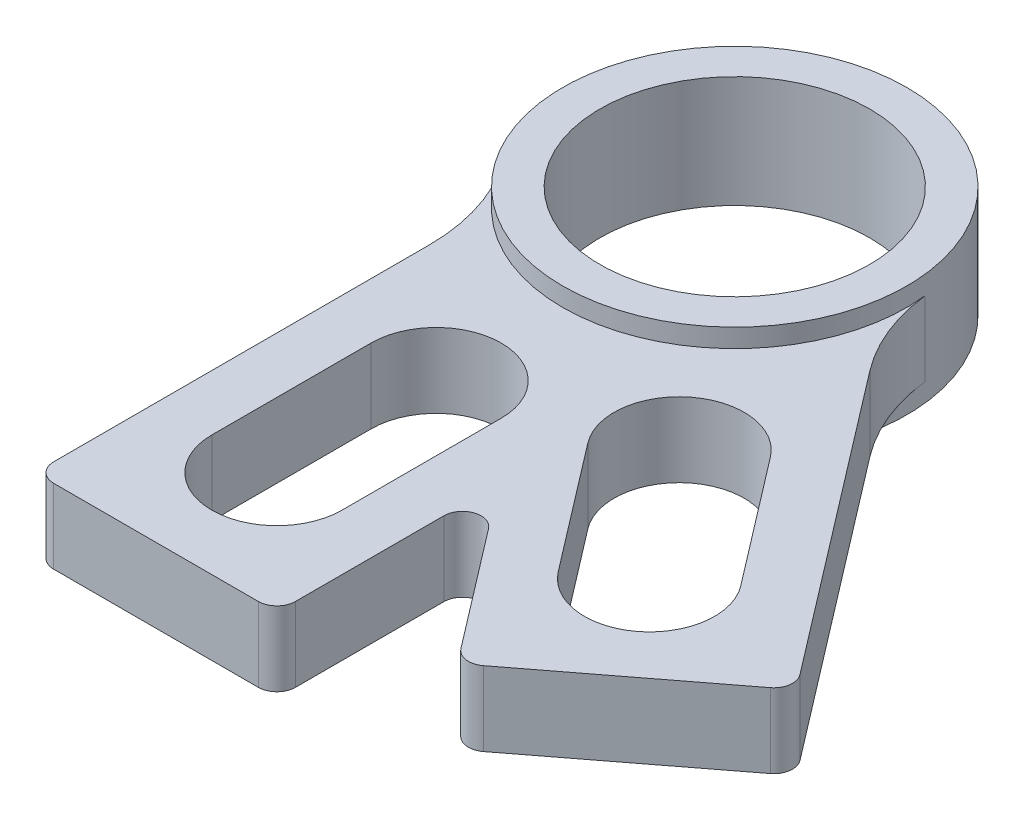
ISO-10303-21;
HEADER;
FILE_DESCRIPTION(('STEP AP214'),'2;1');
FILE_NAME('part.step','',(''),(''),'','','');
FILE_SCHEMA(('AUTOMOTIVE_DESIGN { 1 0 10303 214 1 1 1 1 }'));
ENDSEC;
DATA;
#1=APPLICATION_CONTEXT('core data for automotive mechanical design processes');
#2=APPLICATION_PROTOCOL_DEFINITION('international standard','automotive_design',2000,#1);
#3=PRODUCT_CONTEXT('',#1,'mechanical');
#4=PRODUCT('Part','Part','',(#3));
#5=PRODUCT_RELATED_PRODUCT_CATEGORY('part','',(#4));
#6=PRODUCT_DEFINITION_FORMATION('','',#4);
#7=PRODUCT_DEFINITION_CONTEXT('part definition',#1,'design');
#8=PRODUCT_DEFINITION('design','',#6,#7);
#9=PRODUCT_DEFINITION_SHAPE('','',#8);
#10=(LENGTH_UNIT() NAMED_UNIT(*) SI_UNIT(.MILLI.,.METRE.));
#11=(NAMED_UNIT(*) PLANE_ANGLE_UNIT() SI_UNIT($,.RADIAN.));
#12=(NAMED_UNIT(*) SI_UNIT($,.STERADIAN.) SOLID_ANGLE_UNIT());
#13=UNCERTAINTY_MEASURE_WITH_UNIT(LENGTH_MEASURE(1.E-05),#10,'distance_accuracy_value','');
#14=(GEOMETRIC_REPRESENTATION_CONTEXT(3) GLOBAL_UNCERTAINTY_ASSIGNED_CONTEXT((#13)) GLOBAL_UNIT_ASSIGNED_CONTEXT((#10,
#11,#12)) REPRESENTATION_CONTEXT('',''));
#15=CARTESIAN_POINT('',(0.,0.,0.));
#16=DIRECTION('',(0.,0.,1.));
#17=DIRECTION('',(1.,0.,0.));
#18=AXIS2_PLACEMENT_3D('',#15,#16,#17);
#19=CARTESIAN_POINT('',(0.,4.7625,0.));
#20=DIRECTION('',(0.,-1.,0.));
#21=DIRECTION('',(0.,0.,-1.));
#22=AXIS2_PLACEMENT_3D('',#19,#20,#21);
#23=CYLINDRICAL_SURFACE('',#22,11.5062);
#24=CARTESIAN_POINT('',(0.,4.7625,0.));
#25=DIRECTION('',(0.,1.,0.));
#26=DIRECTION('',(0.,0.,1.));
#27=AXIS2_PLACEMENT_3D('',#24,#25,#26);
#28=CIRCLE('',#27,11.5062);
#29=CARTESIAN_POINT('',(0.,4.7625,-11.5062));
#30=VERTEX_POINT('',#29);
#31=EDGE_CURVE('E301',#30,#30,#28,.T.);
#32=CARTESIAN_POINT('',(0.,-4.7625,0.));
#33=DIRECTION('',(0.,1.,0.));
#34=DIRECTION('',(0.,0.,1.));
#35=AXIS2_PLACEMENT_3D('',#32,#33,#34);
#36=CIRCLE('',#35,11.5062);
#37=CARTESIAN_POINT('',(0.,-4.7625,-11.5062));
#38=VERTEX_POINT('',#37);
#39=EDGE_CURVE('E296',#38,#38,#36,.T.);
#40=CARTESIAN_POINT('',(0.,4.7625,-11.5062));
#41=CARTESIAN_POINT('',(0.,4.66328125,-11.5062));
#42=CARTESIAN_POINT('',(0.,4.5640625,-11.5062));
#43=CARTESIAN_POINT('',(0.,4.365625,-11.5062));
#44=CARTESIAN_POINT('',(0.,4.26640625,-11.5062));
#45=CARTESIAN_POINT('',(0.,4.06796875,-11.5062));
#46=CARTESIAN_POINT('',(0.,3.96875,-11.5062));
#47=CARTESIAN_POINT('',(0.,3.7703125,-11.5062));
#48=CARTESIAN_POINT('',(0.,3.67109375,-11.5062));
#49=CARTESIAN_POINT('',(0.,3.47265625,-11.5062));
#50=CARTESIAN_POINT('',(0.,3.3734375,-11.5062));
#51=CARTESIAN_POINT('',(0.,3.175,-11.5062));
#52=CARTESIAN_POINT('',(0.,3.07578125,-11.5062));
#53=CARTESIAN_POINT('',(0.,2.87734375,-11.5062));
#54=CARTESIAN_POINT('',(0.,2.778125,-11.5062));
#55=CARTESIAN_POINT('',(0.,2.5796875,-11.5062));
#56=CARTESIAN_POINT('',(0.,2.48046875,-11.5062));
#57=CARTESIAN_POINT('',(0.,2.28203125,-11.5062));
#58=CARTESIAN_POINT('',(0.,2.1828125,-11.5062));
#59=CARTESIAN_POINT('',(0.,1.984375,-11.5062));
#60=CARTESIAN_POINT('',(0.,1.88515625,-11.5062));
#61=CARTESIAN_POINT('',(0.,1.68671875,-11.5062));
#62=CARTESIAN_POINT('',(0.,1.5875,-11.5062));
#63=CARTESIAN_POINT('',(0.,1.3890625,-11.5062));
#64=CARTESIAN_POINT('',(0.,1.28984375,-11.5062));
#65=CARTESIAN_POINT('',(0.,1.09140625,-11.5062));
#66=CARTESIAN_POINT('',(0.,0.992187499999999,-11.5062));
#67=CARTESIAN_POINT('',(0.,0.79375,-11.5062));
#68=CARTESIAN_POINT('',(0.,0.69453125,-11.5062));
#69=CARTESIAN_POINT('',(0.,0.49609375,-11.5062));
#70=CARTESIAN_POINT('',(0.,0.396875,-11.5062));
#71=CARTESIAN_POINT('',(0.,0.1984375,-11.5062));
#72=CARTESIAN_POINT('',(0.,0.0992187500000001,-11.5062));
#73=CARTESIAN_POINT('',(0.,-0.0992187500000001,-11.5062));
#74=CARTESIAN_POINT('',(0.,-0.1984375,-11.5062));
#75=CARTESIAN_POINT('',(0.,-0.396875,-11.5062));
#76=CARTESIAN_POINT('',(0.,-0.49609375,-11.5062));
#77=CARTESIAN_POINT('',(0.,-0.69453125,-11.5062));
#78=CARTESIAN_POINT('',(0.,-0.793750000000001,-11.5062));
#79=CARTESIAN_POINT('',(0.,-0.992187500000001,-11.5062));
#80=CARTESIAN_POINT('',(0.,-1.09140625,-11.5062));
#81=CARTESIAN_POINT('',(0.,-1.28984375,-11.5062));
#82=CARTESIAN_POINT('',(0.,-1.3890625,-11.5062));
#83=CARTESIAN_POINT('',(0.,-1.5875,-11.5062));
#84=CARTESIAN_POINT('',(0.,-1.68671875,-11.5062));
#85=CARTESIAN_POINT('',(0.,-1.88515625,-11.5062));
#86=CARTESIAN_POINT('',(0.,-1.984375,-11.5062));
#87=CARTESIAN_POINT('',(0.,-2.1828125,-11.5062));
#88=CARTESIAN_POINT('',(0.,-2.28203125,-11.5062));
#89=CARTESIAN_POINT('',(0.,-2.48046875,-11.5062));
#90=CARTESIAN_POINT('',(0.,-2.5796875,-11.5062));
#91=CARTESIAN_POINT('',(0.,-2.778125,-11.5062));
#92=CARTESIAN_POINT('',(0.,-2.87734375,-11.5062));
#93=CARTESIAN_POINT('',(0.,-3.07578125,-11.5062));
#94=CARTESIAN_POINT('',(0.,-3.175,-11.5062));
#95=CARTESIAN_POINT('',(0.,-3.3734375,-11.5062));
#96=CARTESIAN_POINT('',(0.,-3.47265625,-11.5062));
#97=CARTESIAN_POINT('',(0.,-3.67109375,-11.5062));
#98=CARTESIAN_POINT('',(0.,-3.7703125,-11.5062));
#99=CARTESIAN_POINT('',(0.,-3.96875,-11.5062));
#100=CARTESIAN_POINT('',(0.,-4.06796875,-11.5062));
#101=CARTESIAN_POINT('',(0.,-4.26640625,-11.5062));
#102=CARTESIAN_POINT('',(0.,-4.365625,-11.5062));
#103=CARTESIAN_POINT('',(0.,-4.5640625,-11.5062));
#104=CARTESIAN_POINT('',(0.,-4.66328125,-11.5062));
#105=CARTESIAN_POINT('',(0.,-4.7625,-11.5062));
#106=B_SPLINE_CURVE_WITH_KNOTS('',3,(#40,#41,#42,#43,#44,#45,#46,#47,#48,#49,#50,#51,#52,#53,
#54,#55,#56,#57,#58,#59,#60,#61,#62,#63,#64,#65,#66,#67,#68,#69,#70,#71,#72,#73,#74,#75,#76,#77,
#78,#79,#80,#81,#82,#83,#84,#85,#86,#87,#88,#89,#90,#91,#92,#93,#94,#95,#96,#97,#98,#99,#100,
#101,#102,#103,#104,#105),.UNSPECIFIED.,.F.,.F.,(4,2,2,2,2,2,2,2,2,2,2,2,2,2,2,2,2,2,2,2,2,2,2,
2,2,2,2,2,2,2,2,2,4),(0.,0.29765625,0.5953125,0.892968750000001,1.190625,1.48828125,1.7859375,
2.08359375,2.38125,2.67890625,2.9765625,3.27421875,3.571875,3.86953125,4.1671875,4.46484375,
4.7625,5.06015625,5.3578125,5.65546875,5.953125,6.25078125,6.5484375,6.84609375,7.14375,
7.44140625,7.7390625,8.03671875,8.334375,8.63203125,8.9296875,9.22734375,9.525),.UNSPECIFIED.);
#107=EDGE_CURVE('BSEAM43',#30,#38,#106,.T.);
#108=ORIENTED_EDGE('',*,*,#31,.T.);
#109=ORIENTED_EDGE('',*,*,#39,.F.);
#110=ORIENTED_EDGE('',*,*,#107,.T.);
#111=ORIENTED_EDGE('',*,*,#107,.F.);
#112=EDGE_LOOP('',(#108,#110,#109,#111));
#113=FACE_BOUND('',#112,.T.);
#114=ADVANCED_FACE('F43',(#113),#23,.F.);
#115=CARTESIAN_POINT('',(0.,4.7625,0.));
#116=DIRECTION('',(0.,-1.,0.));
#117=DIRECTION('',(0.,0.,-1.));
#118=AXIS2_PLACEMENT_3D('',#115,#116,#117);
#119=CYLINDRICAL_SURFACE('',#118,14.6812);
#120=DIRECTION('',(0.,-1.,0.));
#121=VECTOR('',#120,1.);
#122=CARTESIAN_POINT('',(14.5866570231038,4.7625,-1.66345133091917));
#123=LINE('',#122,#121);
#124=CARTESIAN_POINT('',(14.5866570231038,3.175,-1.66345133091916));
#125=VERTEX_POINT('',#124);
#126=CARTESIAN_POINT('',(14.5866570231038,-3.175,-1.66345133091916));
#127=VERTEX_POINT('',#126);
#128=EDGE_CURVE('E315',#125,#127,#123,.T.);
#129=ORIENTED_EDGE('',*,*,#128,.T.);
#130=CARTESIAN_POINT('',(0.,-3.175,0.));
#131=DIRECTION('',(0.,1.,0.));
#132=DIRECTION('',(0.,0.,1.));
#133=AXIS2_PLACEMENT_3D('',#130,#131,#132);
#134=CIRCLE('',#133,14.6812);
#135=CARTESIAN_POINT('',(-12.5938687913907,-3.175,7.54533646070437));
#136=VERTEX_POINT('',#135);
#137=EDGE_CURVE('E272',#136,#127,#134,.T.);
#138=ORIENTED_EDGE('',*,*,#137,.F.);
#139=DIRECTION('',(0.,-1.,0.));
#140=VECTOR('',#139,1.);
#141=CARTESIAN_POINT('',(-12.5938687913907,4.7625,7.54533646070436));
#142=LINE('',#141,#140);
#143=CARTESIAN_POINT('',(-12.5938687913907,3.175,7.54533646070437));
#144=VERTEX_POINT('',#143);
#145=EDGE_CURVE('E308',#136,#144,#142,.F.);
#146=ORIENTED_EDGE('',*,*,#145,.T.);
#147=CARTESIAN_POINT('',(0.,3.175,0.));
#148=DIRECTION('',(0.,1.,0.));
#149=DIRECTION('',(0.,0.,1.));
#150=AXIS2_PLACEMENT_3D('',#147,#148,#149);
#151=CIRCLE('',#150,14.6812);
#152=EDGE_CURVE('E234',#144,#125,#151,.T.);
#153=ORIENTED_EDGE('',*,*,#152,.T.);
#154=EDGE_LOOP('',(#129,#138,#146,#153));
#155=FACE_BOUND('',#154,.T.);
#156=CARTESIAN_POINT('',(0.,4.7625,0.));
#157=DIRECTION('',(0.,1.,0.));
#158=DIRECTION('',(0.,0.,1.));
#159=AXIS2_PLACEMENT_3D('',#156,#157,#158);
#160=CIRCLE('',#159,14.6812);
#161=CARTESIAN_POINT('',(0.,4.7625,14.6812));
#162=VERTEX_POINT('',#161);
#163=EDGE_CURVE('E304',#162,#162,#160,.T.);
#164=ORIENTED_EDGE('',*,*,#163,.F.);
#165=EDGE_LOOP('',(#164));
#166=FACE_BOUND('',#165,.T.);
#167=CARTESIAN_POINT('',(0.,-4.7625,0.));
#168=DIRECTION('',(0.,1.,0.));
#169=DIRECTION('',(0.,0.,1.));
#170=AXIS2_PLACEMENT_3D('',#167,#168,#169);
#171=CIRCLE('',#170,14.6812);
#172=CARTESIAN_POINT('',(0.,-4.7625,14.6812));
#173=VERTEX_POINT('',#172);
#174=EDGE_CURVE('E305',#173,#173,#171,.T.);
#175=ORIENTED_EDGE('',*,*,#174,.T.);
#176=EDGE_LOOP('',(#175));
#177=FACE_BOUND('',#176,.T.);
#178=ADVANCED_FACE('F411',(#155,#166,#177),#119,.T.);
#179=CARTESIAN_POINT('',(0.,4.7625,0.));
#180=DIRECTION('',(0.,1.,0.));
#181=DIRECTION('',(0.,0.,1.));
#182=AXIS2_PLACEMENT_3D('',#179,#180,#181);
#183=PLANE('',#182);
#184=ORIENTED_EDGE('',*,*,#31,.F.);
#185=EDGE_LOOP('',(#184));
#186=FACE_BOUND('',#185,.T.);
#187=ORIENTED_EDGE('',*,*,#163,.T.);
#188=EDGE_LOOP('',(#187));
#189=FACE_BOUND('',#188,.T.);
#190=ADVANCED_FACE('F447',(#186,#189),#183,.T.);
#191=CARTESIAN_POINT('',(0.,-4.7625,0.));
#192=DIRECTION('',(0.,1.,0.));
#193=DIRECTION('',(0.,0.,1.));
#194=AXIS2_PLACEMENT_3D('',#191,#192,#193);
#195=PLANE('',#194);
#196=ORIENTED_EDGE('',*,*,#39,.T.);
#197=EDGE_LOOP('',(#196));
#198=FACE_BOUND('',#197,.T.);
#199=ORIENTED_EDGE('',*,*,#174,.F.);
#200=EDGE_LOOP('',(#199));
#201=FACE_BOUND('',#200,.T.);
#202=ADVANCED_FACE('F621',(#198,#201),#195,.F.);
#203=CARTESIAN_POINT('',(-10.31875,3.175,0.));
#204=DIRECTION('',(-1.,0.,0.));
#205=DIRECTION('',(0.,0.,1.));
#206=AXIS2_PLACEMENT_3D('',#203,#204,#205);
#207=PLANE('',#206);
#208=DIRECTION('',(0.,0.,-1.));
#209=VECTOR('',#208,1.);
#210=CARTESIAN_POINT('',(-10.31875,-3.175,0.));
#211=LINE('',#210,#209);
#212=CARTESIAN_POINT('',(-10.31875,-3.175,47.8028));
#213=VERTEX_POINT('',#212);
#214=CARTESIAN_POINT('',(-10.31875,-3.175,15.7694921185655));
#215=VERTEX_POINT('',#214);
#216=EDGE_CURVE('E274',#213,#215,#211,.T.);
#217=ORIENTED_EDGE('',*,*,#216,.F.);
#218=DIRECTION('',(0.,-1.,0.));
#219=VECTOR('',#218,1.);
#220=CARTESIAN_POINT('',(-10.31875,3.175,47.8028));
#221=LINE('',#220,#219);
#222=CARTESIAN_POINT('',(-10.31875,3.175,47.8028));
#223=VERTEX_POINT('',#222);
#224=EDGE_CURVE('E374',#213,#223,#221,.F.);
#225=ORIENTED_EDGE('',*,*,#224,.T.);
#226=DIRECTION('',(0.,0.,-1.));
#227=VECTOR('',#226,1.);
#228=CARTESIAN_POINT('',(-10.31875,3.175,0.));
#229=LINE('',#228,#227);
#230=CARTESIAN_POINT('',(-10.31875,3.175,15.7694921185655));
#231=VERTEX_POINT('',#230);
#232=EDGE_CURVE('E236',#223,#231,#229,.T.);
#233=ORIENTED_EDGE('',*,*,#232,.T.);
#234=DIRECTION('',(0.,-1.,0.));
#235=VECTOR('',#234,1.);
#236=CARTESIAN_POINT('',(-10.31875,3.175,15.7694921185655));
#237=LINE('',#236,#235);
#238=EDGE_CURVE('E321',#231,#215,#237,.T.);
#239=ORIENTED_EDGE('',*,*,#238,.T.);
#240=EDGE_LOOP('',(#217,#225,#233,#239));
#241=FACE_BOUND('',#240,.T.);
#242=ADVANCED_FACE('F613',(#241),#207,.T.);
#243=CARTESIAN_POINT('',(0.,3.175,49.3903));
#244=DIRECTION('',(0.,0.,-1.));
#245=DIRECTION('',(-1.,0.,0.));
#246=AXIS2_PLACEMENT_3D('',#243,#244,#245);
#247=PLANE('',#246);
#248=DIRECTION('',(1.,0.,0.));
#249=VECTOR('',#248,1.);
#250=CARTESIAN_POINT('',(0.,-3.175,49.3903));
#251=LINE('',#250,#249);
#252=CARTESIAN_POINT('',(-8.73124999999999,-3.175,49.3903));
#253=VERTEX_POINT('',#252);
#254=CARTESIAN_POINT('',(8.73125,-3.175,49.3903));
#255=VERTEX_POINT('',#254);
#256=EDGE_CURVE('E276',#253,#255,#251,.T.);
#257=ORIENTED_EDGE('',*,*,#256,.T.);
#258=DIRECTION('',(0.,-1.,0.));
#259=VECTOR('',#258,1.);
#260=CARTESIAN_POINT('',(8.73125,3.175,49.3903));
#261=LINE('',#260,#259);
#262=CARTESIAN_POINT('',(8.73125,3.175,49.3903));
#263=VERTEX_POINT('',#262);
#264=EDGE_CURVE('E372',#255,#263,#261,.F.);
#265=ORIENTED_EDGE('',*,*,#264,.T.);
#266=DIRECTION('',(1.,0.,0.));
#267=VECTOR('',#266,1.);
#268=CARTESIAN_POINT('',(0.,3.175,49.3903));
#269=LINE('',#268,#267);
#270=CARTESIAN_POINT('',(-8.73124999999999,3.175,49.3903));
#271=VERTEX_POINT('',#270);
#272=EDGE_CURVE('E238',#271,#263,#269,.T.);
#273=ORIENTED_EDGE('',*,*,#272,.F.);
#274=DIRECTION('',(0.,-1.,0.));
#275=VECTOR('',#274,1.);
#276=CARTESIAN_POINT('',(-8.73124999999999,-3.175,49.3903));
#277=LINE('',#276,#275);
#278=EDGE_CURVE('E369',#271,#253,#277,.T.);
#279=ORIENTED_EDGE('',*,*,#278,.T.);
#280=EDGE_LOOP('',(#257,#265,#273,#279));
#281=FACE_BOUND('',#280,.T.);
#282=ADVANCED_FACE('F428',(#281),#247,.F.);
#283=CARTESIAN_POINT('',(10.31875,3.175,0.));
#284=DIRECTION('',(-1.,0.,0.));
#285=DIRECTION('',(0.,0.,1.));
#286=AXIS2_PLACEMENT_3D('',#283,#284,#285);
#287=PLANE('',#286);
#288=DIRECTION('',(0.,0.,-1.));
#289=VECTOR('',#288,1.);
#290=CARTESIAN_POINT('',(10.31875,-3.175,0.));
#291=LINE('',#290,#289);
#292=CARTESIAN_POINT('',(10.31875,-3.175,47.8028));
#293=VERTEX_POINT('',#292);
#294=CARTESIAN_POINT('',(10.31875,-3.175,35.1423165352123));
#295=VERTEX_POINT('',#294);
#296=EDGE_CURVE('E279',#293,#295,#291,.T.);
#297=ORIENTED_EDGE('',*,*,#296,.T.);
#298=DIRECTION('',(0.,-1.,0.));
#299=VECTOR('',#298,1.);
#300=CARTESIAN_POINT('',(10.31875,3.175,35.1423165352123));
#301=LINE('',#300,#299);
#302=CARTESIAN_POINT('',(10.31875,3.175,35.1423165352123));
#303=VERTEX_POINT('',#302);
#304=EDGE_CURVE('E367',#295,#303,#301,.F.);
#305=ORIENTED_EDGE('',*,*,#304,.T.);
#306=DIRECTION('',(0.,0.,-1.));
#307=VECTOR('',#306,1.);
#308=CARTESIAN_POINT('',(10.31875,3.175,0.));
#309=LINE('',#308,#307);
#310=CARTESIAN_POINT('',(10.31875,3.175,47.8028));
#311=VERTEX_POINT('',#310);
#312=EDGE_CURVE('E241',#311,#303,#309,.T.);
#313=ORIENTED_EDGE('',*,*,#312,.F.);
#314=DIRECTION('',(0.,-1.,0.));
#315=VECTOR('',#314,1.);
#316=CARTESIAN_POINT('',(10.31875,3.175,47.8028));
#317=LINE('',#316,#315);
#318=EDGE_CURVE('E364',#311,#293,#317,.T.);
#319=ORIENTED_EDGE('',*,*,#318,.T.);
#320=EDGE_LOOP('',(#297,#305,#313,#319));
#321=FACE_BOUND('',#320,.T.);
#322=ADVANCED_FACE('F383',(#321),#287,.F.);
#323=CARTESIAN_POINT('',(-8.19377036826883,3.175,6.27205936790873));
#324=DIRECTION('',(-0.794066177421601,0.,0.607831313667737));
#325=DIRECTION('',(0.607831313667737,0.,0.794066177421601));
#326=AXIS2_PLACEMENT_3D('',#323,#324,#325);
#327=PLANE('',#326);
#328=DIRECTION('',(-0.607831313667737,0.,-0.794066177421601));
#329=VECTOR('',#328,1.);
#330=CARTESIAN_POINT('',(-8.19377036826883,-3.175,6.27205936790873));
#331=LINE('',#330,#329);
#332=CARTESIAN_POINT('',(20.8622683527273,-3.175,44.230646033958));
#333=VERTEX_POINT('',#332);
#334=CARTESIAN_POINT('',(13.1668300566568,-3.175,34.1773843247648));
#335=VERTEX_POINT('',#334);
#336=EDGE_CURVE('E282',#333,#335,#331,.T.);
#337=ORIENTED_EDGE('',*,*,#336,.F.);
#338=DIRECTION('',(0.,-1.,0.));
#339=VECTOR('',#338,1.);
#340=CARTESIAN_POINT('',(20.8622683527273,3.175,44.230646033958));
#341=LINE('',#340,#339);
#342=CARTESIAN_POINT('',(20.8622683527273,3.175,44.230646033958));
#343=VERTEX_POINT('',#342);
#344=EDGE_CURVE('E63',#333,#343,#341,.F.);
#345=ORIENTED_EDGE('',*,*,#344,.T.);
#346=DIRECTION('',(-0.607831313667737,0.,-0.794066177421601));
#347=VECTOR('',#346,1.);
#348=CARTESIAN_POINT('',(-8.19377036826883,3.175,6.27205936790873));
#349=LINE('',#348,#347);
#350=CARTESIAN_POINT('',(13.1668300566568,3.175,34.1773843247648));
#351=VERTEX_POINT('',#350);
#352=EDGE_CURVE('E243',#343,#351,#349,.T.);
#353=ORIENTED_EDGE('',*,*,#352,.T.);
#354=DIRECTION('',(0.,-1.,0.));
#355=VECTOR('',#354,1.);
#356=CARTESIAN_POINT('',(13.1668300566568,3.175,34.1773843247648));
#357=LINE('',#356,#355);
#358=EDGE_CURVE('E360',#351,#335,#357,.T.);
#359=ORIENTED_EDGE('',*,*,#358,.T.);
#360=EDGE_LOOP('',(#337,#345,#353,#359));
#361=FACE_BOUND('',#360,.T.);
#362=ADVANCED_FACE('F387',(#361),#327,.T.);
#363=CARTESIAN_POINT('',(30.0209709314436,3.175,39.2191667227061));
#364=DIRECTION('',(-0.607831313667737,0.,-0.794066177421601));
#365=DIRECTION('',(-0.794066177421601,0.,0.607831313667737));
#366=AXIS2_PLACEMENT_3D('',#363,#364,#365);
#367=PLANE('',#366);
#368=DIRECTION('',(0.794066177421601,0.,-0.607831313667737));
#369=VECTOR('',#368,1.);
#370=CARTESIAN_POINT('',(30.0209709314436,-3.175,39.2191667227061));
#371=LINE('',#370,#369);
#372=CARTESIAN_POINT('',(23.0877806198316,-3.175,44.5262938801673));
#373=VERTEX_POINT('',#372);
#374=CARTESIAN_POINT('',(36.9541612430563,-3.175,33.9120395652444));
#375=VERTEX_POINT('',#374);
#376=EDGE_CURVE('E285',#373,#375,#371,.T.);
#377=ORIENTED_EDGE('',*,*,#376,.T.);
#378=DIRECTION('',(0.,-1.,0.));
#379=VECTOR('',#378,1.);
#380=CARTESIAN_POINT('',(36.9541612430563,3.175,33.9120395652444));
#381=LINE('',#380,#379);
#382=CARTESIAN_POINT('',(36.9541612430563,3.175,33.9120395652444));
#383=VERTEX_POINT('',#382);
#384=EDGE_CURVE('E350',#375,#383,#381,.F.);
#385=ORIENTED_EDGE('',*,*,#384,.T.);
#386=DIRECTION('',(0.794066177421601,0.,-0.607831313667737));
#387=VECTOR('',#386,1.);
#388=CARTESIAN_POINT('',(30.0209709314436,3.175,39.2191667227061));
#389=LINE('',#388,#387);
#390=CARTESIAN_POINT('',(23.0877806198316,3.175,44.5262938801673));
#391=VERTEX_POINT('',#390);
#392=EDGE_CURVE('E245',#391,#383,#389,.T.);
#393=ORIENTED_EDGE('',*,*,#392,.F.);
#394=DIRECTION('',(0.,-1.,0.));
#395=VECTOR('',#394,1.);
#396=CARTESIAN_POINT('',(23.0877806198316,-3.175,44.5262938801673));
#397=LINE('',#396,#395);
#398=EDGE_CURVE('E347',#391,#373,#397,.T.);
#399=ORIENTED_EDGE('',*,*,#398,.T.);
#400=EDGE_LOOP('',(#377,#385,#393,#399));
#401=FACE_BOUND('',#400,.T.);
#402=ADVANCED_FACE('F395',(#401),#367,.F.);
#403=CARTESIAN_POINT('',(0.,3.175,25.48255));
#404=DIRECTION('',(0.,-1.,0.));
#405=DIRECTION('',(0.,0.,-1.));
#406=AXIS2_PLACEMENT_3D('',#403,#404,#405);
#407=CYLINDRICAL_SURFACE('',#406,5.55625);
#408=CARTESIAN_POINT('',(0.,-3.175,25.48255));
#409=DIRECTION('',(0.,1.,0.));
#410=DIRECTION('',(0.,0.,1.));
#411=AXIS2_PLACEMENT_3D('',#408,#409,#410);
#412=CIRCLE('',#411,5.55625);
#413=CARTESIAN_POINT('',(5.55625,-3.175,25.48255));
#414=VERTEX_POINT('',#413);
#415=CARTESIAN_POINT('',(-5.55624999999999,-3.175,25.48255));
#416=VERTEX_POINT('',#415);
#417=EDGE_CURVE('E260',#414,#416,#412,.T.);
#418=ORIENTED_EDGE('',*,*,#417,.F.);
#419=DIRECTION('',(0.,-1.,0.));
#420=VECTOR('',#419,1.);
#421=CARTESIAN_POINT('',(5.55625,3.175,25.48255));
#422=LINE('',#421,#420);
#423=CARTESIAN_POINT('',(5.55625,3.175,25.48255));
#424=VERTEX_POINT('',#423);
#425=EDGE_CURVE('E294',#424,#414,#422,.T.);
#426=ORIENTED_EDGE('',*,*,#425,.F.);
#427=CARTESIAN_POINT('',(0.,3.175,25.48255));
#428=DIRECTION('',(0.,1.,0.));
#429=DIRECTION('',(0.,0.,1.));
#430=AXIS2_PLACEMENT_3D('',#427,#428,#429);
#431=CIRCLE('',#430,5.55625);
#432=CARTESIAN_POINT('',(-5.55624999999999,3.175,25.48255));
#433=VERTEX_POINT('',#432);
#434=EDGE_CURVE('E223',#424,#433,#431,.T.);
#435=ORIENTED_EDGE('',*,*,#434,.T.);
#436=DIRECTION('',(0.,-1.,0.));
#437=VECTOR('',#436,1.);
#438=CARTESIAN_POINT('',(-5.55624999999999,3.175,25.48255));
#439=LINE('',#438,#437);
#440=EDGE_CURVE('E202',#433,#416,#439,.T.);
#441=ORIENTED_EDGE('',*,*,#440,.T.);
#442=EDGE_LOOP('',(#418,#426,#435,#441));
#443=FACE_BOUND('',#442,.T.);
#444=ADVANCED_FACE('F575',(#443),#407,.F.);
#445=CARTESIAN_POINT('',(5.55625,3.175,0.));
#446=DIRECTION('',(-1.,0.,0.));
#447=DIRECTION('',(0.,0.,1.));
#448=AXIS2_PLACEMENT_3D('',#445,#446,#447);
#449=PLANE('',#448);
#450=DIRECTION('',(0.,0.,-1.));
#451=VECTOR('',#450,1.);
#452=CARTESIAN_POINT('',(5.55625,-3.175,0.));
#453=LINE('',#452,#451);
#454=CARTESIAN_POINT('',(5.55625,-3.175,39.07155));
#455=VERTEX_POINT('',#454);
#456=EDGE_CURVE('E263',#455,#414,#453,.T.);
#457=ORIENTED_EDGE('',*,*,#456,.F.);
#458=DIRECTION('',(0.,-1.,0.));
#459=VECTOR('',#458,1.);
#460=CARTESIAN_POINT('',(5.55625,3.175,39.07155));
#461=LINE('',#460,#459);
#462=CARTESIAN_POINT('',(5.55625,3.175,39.07155));
#463=VERTEX_POINT('',#462);
#464=EDGE_CURVE('E292',#463,#455,#461,.T.);
#465=ORIENTED_EDGE('',*,*,#464,.F.);
#466=DIRECTION('',(0.,0.,-1.));
#467=VECTOR('',#466,1.);
#468=CARTESIAN_POINT('',(5.55625,3.175,0.));
#469=LINE('',#468,#467);
#470=EDGE_CURVE('E226',#463,#424,#469,.T.);
#471=ORIENTED_EDGE('',*,*,#470,.T.);
#472=ORIENTED_EDGE('',*,*,#425,.T.);
#473=EDGE_LOOP('',(#457,#465,#471,#472));
#474=FACE_BOUND('',#473,.T.);
#475=ADVANCED_FACE('F566',(#474),#449,.T.);
#476=CARTESIAN_POINT('',(0.,3.175,39.07155));
#477=DIRECTION('',(0.,-1.,0.));
#478=DIRECTION('',(0.,0.,-1.));
#479=AXIS2_PLACEMENT_3D('',#476,#477,#478);
#480=CYLINDRICAL_SURFACE('',#479,5.55625);
#481=CARTESIAN_POINT('',(0.,-3.175,39.07155));
#482=DIRECTION('',(0.,1.,0.));
#483=DIRECTION('',(0.,0.,1.));
#484=AXIS2_PLACEMENT_3D('',#481,#482,#483);
#485=CIRCLE('',#484,5.55625);
#486=CARTESIAN_POINT('',(-5.55625,-3.175,39.07155));
#487=VERTEX_POINT('',#486);
#488=EDGE_CURVE('E266',#487,#455,#485,.T.);
#489=ORIENTED_EDGE('',*,*,#488,.F.);
#490=DIRECTION('',(0.,-1.,0.));
#491=VECTOR('',#490,1.);
#492=CARTESIAN_POINT('',(-5.55625,3.175,39.07155));
#493=LINE('',#492,#491);
#494=CARTESIAN_POINT('',(-5.55625,3.175,39.07155));
#495=VERTEX_POINT('',#494);
#496=EDGE_CURVE('E290',#495,#487,#493,.T.);
#497=ORIENTED_EDGE('',*,*,#496,.F.);
#498=CARTESIAN_POINT('',(0.,3.175,39.07155));
#499=DIRECTION('',(0.,1.,0.));
#500=DIRECTION('',(0.,0.,1.));
#501=AXIS2_PLACEMENT_3D('',#498,#499,#500);
#502=CIRCLE('',#501,5.55625);
#503=EDGE_CURVE('E229',#495,#463,#502,.T.);
#504=ORIENTED_EDGE('',*,*,#503,.T.);
#505=ORIENTED_EDGE('',*,*,#464,.T.);
#506=EDGE_LOOP('',(#489,#497,#504,#505));
#507=FACE_BOUND('',#506,.T.);
#508=ADVANCED_FACE('F558',(#507),#480,.F.);
#509=CARTESIAN_POINT('',(15.4890918421041,3.175,20.2348310694546));
#510=DIRECTION('',(0.,-1.,0.));
#511=DIRECTION('',(0.,0.,-1.));
#512=AXIS2_PLACEMENT_3D('',#509,#510,#511);
#513=CYLINDRICAL_SURFACE('',#512,5.55625000000001);
#514=CARTESIAN_POINT('',(15.4890918421041,-3.175,20.2348310694546));
#515=DIRECTION('',(0.,1.,0.));
#516=DIRECTION('',(0.,0.,1.));
#517=AXIS2_PLACEMENT_3D('',#514,#515,#516);
#518=CIRCLE('',#517,5.55625000000001);
#519=CARTESIAN_POINT('',(19.9011220404029,-3.175,16.8575683328882));
#520=VERTEX_POINT('',#519);
#521=CARTESIAN_POINT('',(11.0770616438053,-3.175,23.6120938060209));
#522=VERTEX_POINT('',#521);
#523=EDGE_CURVE('E197',#520,#522,#518,.T.);
#524=ORIENTED_EDGE('',*,*,#523,.F.);
#525=DIRECTION('',(0.,-1.,0.));
#526=VECTOR('',#525,1.);
#527=CARTESIAN_POINT('',(19.9011220404029,3.175,16.8575683328882));
#528=LINE('',#527,#526);
#529=CARTESIAN_POINT('',(19.9011220404029,3.175,16.8575683328882));
#530=VERTEX_POINT('',#529);
#531=EDGE_CURVE('E192',#530,#520,#528,.T.);
#532=ORIENTED_EDGE('',*,*,#531,.F.);
#533=CARTESIAN_POINT('',(15.4890918421041,3.175,20.2348310694546));
#534=DIRECTION('',(0.,1.,0.));
#535=DIRECTION('',(0.,0.,1.));
#536=AXIS2_PLACEMENT_3D('',#533,#534,#535);
#537=CIRCLE('',#536,5.55625000000001);
#538=CARTESIAN_POINT('',(11.0770616438053,3.175,23.6120938060209));
#539=VERTEX_POINT('',#538);
#540=EDGE_CURVE('E195',#530,#539,#537,.T.);
#541=ORIENTED_EDGE('',*,*,#540,.T.);
#542=DIRECTION('',(0.,-1.,0.));
#543=VECTOR('',#542,1.);
#544=CARTESIAN_POINT('',(11.0770616438053,3.175,23.6120938060209));
#545=LINE('',#544,#543);
#546=EDGE_CURVE('E250',#539,#522,#545,.T.);
#547=ORIENTED_EDGE('',*,*,#546,.T.);
#548=EDGE_LOOP('',(#524,#532,#541,#547));
#549=FACE_BOUND('',#548,.T.);
#550=ADVANCED_FACE('F194',(#549),#513,.F.);
#551=CARTESIAN_POINT('',(4.41203019829913,3.175,-3.37726273656663));
#552=DIRECTION('',(-0.794066177421601,0.,0.607831313667736));
#553=DIRECTION('',(0.607831313667736,0.,0.794066177421601));
#554=AXIS2_PLACEMENT_3D('',#551,#552,#553);
#555=PLANE('',#554);
#556=DIRECTION('',(-0.607831313667736,0.,-0.794066177421601));
#557=VECTOR('',#556,1.);
#558=CARTESIAN_POINT('',(4.41203019829913,-3.175,-3.37726273656663));
#559=LINE('',#558,#557);
#560=CARTESIAN_POINT('',(28.1609417618338,-3.175,27.6481336178703));
#561=VERTEX_POINT('',#560);
#562=EDGE_CURVE('E252',#561,#520,#559,.T.);
#563=ORIENTED_EDGE('',*,*,#562,.F.);
#564=DIRECTION('',(0.,-1.,0.));
#565=VECTOR('',#564,1.);
#566=CARTESIAN_POINT('',(28.1609417618338,3.175,27.6481336178703));
#567=LINE('',#566,#565);
#568=CARTESIAN_POINT('',(28.1609417618338,3.175,27.6481336178703));
#569=VERTEX_POINT('',#568);
#570=EDGE_CURVE('E203',#569,#561,#567,.T.);
#571=ORIENTED_EDGE('',*,*,#570,.F.);
#572=DIRECTION('',(-0.607831313667736,0.,-0.794066177421601));
#573=VECTOR('',#572,1.);
#574=CARTESIAN_POINT('',(4.41203019829913,3.175,-3.37726273656663));
#575=LINE('',#574,#573);
#576=EDGE_CURVE('E210',#569,#530,#575,.T.);
#577=ORIENTED_EDGE('',*,*,#576,.T.);
#578=ORIENTED_EDGE('',*,*,#531,.T.);
#579=EDGE_LOOP('',(#563,#571,#577,#578));
#580=FACE_BOUND('',#579,.T.);
#581=ADVANCED_FACE('F217',(#580),#555,.T.);
#582=CARTESIAN_POINT('',(23.748911563535,3.175,31.0253963544367));
#583=DIRECTION('',(0.,-1.,0.));
#584=DIRECTION('',(0.,0.,-1.));
#585=AXIS2_PLACEMENT_3D('',#582,#583,#584);
#586=CYLINDRICAL_SURFACE('',#585,5.55625);
#587=CARTESIAN_POINT('',(23.748911563535,-3.175,31.0253963544367));
#588=DIRECTION('',(0.,1.,0.));
#589=DIRECTION('',(0.,0.,1.));
#590=AXIS2_PLACEMENT_3D('',#587,#588,#589);
#591=CIRCLE('',#590,5.55625);
#592=CARTESIAN_POINT('',(19.3368813652362,-3.175,34.4026590910031));
#593=VERTEX_POINT('',#592);
#594=EDGE_CURVE('E254',#593,#561,#591,.T.);
#595=ORIENTED_EDGE('',*,*,#594,.F.);
#596=DIRECTION('',(0.,-1.,0.));
#597=VECTOR('',#596,1.);
#598=CARTESIAN_POINT('',(19.3368813652362,3.175,34.4026590910031));
#599=LINE('',#598,#597);
#600=CARTESIAN_POINT('',(19.3368813652362,3.175,34.4026590910031));
#601=VERTEX_POINT('',#600);
#602=EDGE_CURVE('E298',#601,#593,#599,.T.);
#603=ORIENTED_EDGE('',*,*,#602,.F.);
#604=CARTESIAN_POINT('',(23.748911563535,3.175,31.0253963544367));
#605=DIRECTION('',(0.,1.,0.));
#606=DIRECTION('',(0.,0.,1.));
#607=AXIS2_PLACEMENT_3D('',#604,#605,#606);
#608=CIRCLE('',#607,5.55625);
#609=EDGE_CURVE('E218',#601,#569,#608,.T.);
#610=ORIENTED_EDGE('',*,*,#609,.T.);
#611=ORIENTED_EDGE('',*,*,#570,.T.);
#612=EDGE_LOOP('',(#595,#603,#610,#611));
#613=FACE_BOUND('',#612,.T.);
#614=ADVANCED_FACE('F534',(#613),#586,.F.);
#615=CARTESIAN_POINT('',(-5.55624999999999,3.175,0.));
#616=DIRECTION('',(-1.,0.,0.));
#617=DIRECTION('',(0.,0.,1.));
#618=AXIS2_PLACEMENT_3D('',#615,#616,#617);
#619=PLANE('',#618);
#620=DIRECTION('',(0.,0.,-1.));
#621=VECTOR('',#620,1.);
#622=CARTESIAN_POINT('',(-5.55624999999999,-3.175,0.));
#623=LINE('',#622,#621);
#624=EDGE_CURVE('E269',#487,#416,#623,.T.);
#625=ORIENTED_EDGE('',*,*,#624,.T.);
#626=ORIENTED_EDGE('',*,*,#440,.F.);
#627=DIRECTION('',(0.,0.,-1.));
#628=VECTOR('',#627,1.);
#629=CARTESIAN_POINT('',(-5.55624999999999,3.175,0.));
#630=LINE('',#629,#628);
#631=EDGE_CURVE('E232',#495,#433,#630,.T.);
#632=ORIENTED_EDGE('',*,*,#631,.F.);
#633=ORIENTED_EDGE('',*,*,#496,.T.);
#634=EDGE_LOOP('',(#625,#626,#632,#633));
#635=FACE_BOUND('',#634,.T.);
#636=ADVANCED_FACE('F525',(#635),#619,.F.);
#637=CARTESIAN_POINT('',(-4.41203019829845,3.175,3.37726273656612));
#638=DIRECTION('',(-0.794066177421601,0.,0.607831313667737));
#639=DIRECTION('',(0.607831313667737,0.,0.794066177421601));
#640=AXIS2_PLACEMENT_3D('',#637,#638,#639);
#641=PLANE('',#640);
#642=DIRECTION('',(-0.607831313667737,0.,-0.794066177421601));
#643=VECTOR('',#642,1.);
#644=CARTESIAN_POINT('',(-4.41203019829845,-3.175,3.37726273656612));
#645=LINE('',#644,#643);
#646=EDGE_CURVE('E257',#593,#522,#645,.T.);
#647=ORIENTED_EDGE('',*,*,#646,.T.);
#648=ORIENTED_EDGE('',*,*,#546,.F.);
#649=DIRECTION('',(-0.607831313667737,0.,-0.794066177421601));
#650=VECTOR('',#649,1.);
#651=CARTESIAN_POINT('',(-4.41203019829845,3.175,3.37726273656612));
#652=LINE('',#651,#650);
#653=EDGE_CURVE('E213',#601,#539,#652,.T.);
#654=ORIENTED_EDGE('',*,*,#653,.F.);
#655=ORIENTED_EDGE('',*,*,#602,.T.);
#656=EDGE_LOOP('',(#647,#648,#654,#655));
#657=FACE_BOUND('',#656,.T.);
#658=ADVANCED_FACE('F517',(#657),#641,.F.);
#659=CARTESIAN_POINT('',(8.19377036826945,3.175,-6.2720593679092));
#660=DIRECTION('',(-0.794066177421601,0.,0.607831313667737));
#661=DIRECTION('',(0.607831313667737,0.,0.794066177421601));
#662=AXIS2_PLACEMENT_3D('',#659,#660,#661);
#663=PLANE('',#662);
#664=DIRECTION('',(-0.607831313667737,0.,-0.794066177421601));
#665=VECTOR('',#664,1.);
#666=CARTESIAN_POINT('',(8.19377036826945,3.175,-6.2720593679092));
#667=LINE('',#666,#665);
#668=CARTESIAN_POINT('',(37.2498090892656,3.175,31.6865272981401));
#669=VERTEX_POINT('',#668);
#670=CARTESIAN_POINT('',(17.7789614785698,3.175,6.24996095855966));
#671=VERTEX_POINT('',#670);
#672=EDGE_CURVE('E248',#669,#671,#667,.T.);
#673=ORIENTED_EDGE('',*,*,#672,.F.);
#674=DIRECTION('',(0.,-1.,0.));
#675=VECTOR('',#674,1.);
#676=CARTESIAN_POINT('',(37.2498090892656,3.175,31.6865272981401));
#677=LINE('',#676,#675);
#678=CARTESIAN_POINT('',(37.2498090892656,-3.175,31.6865272981401));
#679=VERTEX_POINT('',#678);
#680=EDGE_CURVE('E336',#669,#679,#677,.T.);
#681=ORIENTED_EDGE('',*,*,#680,.T.);
#682=DIRECTION('',(-0.607831313667737,0.,-0.794066177421601));
#683=VECTOR('',#682,1.);
#684=CARTESIAN_POINT('',(8.19377036826945,-3.175,-6.2720593679092));
#685=LINE('',#684,#683);
#686=CARTESIAN_POINT('',(17.7789614785698,-3.175,6.24996095855966));
#687=VERTEX_POINT('',#686);
#688=EDGE_CURVE('E215',#679,#687,#685,.T.);
#689=ORIENTED_EDGE('',*,*,#688,.T.);
#690=DIRECTION('',(0.,1.,0.));
#691=VECTOR('',#690,1.);
#692=CARTESIAN_POINT('',(17.7789614785698,3.175,6.24996095855966));
#693=LINE('',#692,#691);
#694=EDGE_CURVE('E318',#687,#671,#693,.T.);
#695=ORIENTED_EDGE('',*,*,#694,.T.);
#696=EDGE_LOOP('',(#673,#681,#689,#695));
#697=FACE_BOUND('',#696,.T.);
#698=ADVANCED_FACE('F403',(#697),#663,.F.);
#699=CARTESIAN_POINT('',(0.,3.175,0.));
#700=DIRECTION('',(0.,1.,0.));
#701=DIRECTION('',(0.,0.,1.));
#702=AXIS2_PLACEMENT_3D('',#699,#700,#701);
#703=PLANE('',#702);
#704=ORIENTED_EDGE('',*,*,#540,.F.);
#705=ORIENTED_EDGE('',*,*,#576,.F.);
#706=ORIENTED_EDGE('',*,*,#609,.F.);
#707=ORIENTED_EDGE('',*,*,#653,.T.);
#708=EDGE_LOOP('',(#704,#705,#706,#707));
#709=FACE_BOUND('',#708,.T.);
#710=ORIENTED_EDGE('',*,*,#434,.F.);
#711=ORIENTED_EDGE('',*,*,#470,.F.);
#712=ORIENTED_EDGE('',*,*,#503,.F.);
#713=ORIENTED_EDGE('',*,*,#631,.T.);
#714=EDGE_LOOP('',(#710,#711,#712,#713));
#715=FACE_BOUND('',#714,.T.);
#716=ORIENTED_EDGE('',*,*,#392,.T.);
#717=CARTESIAN_POINT('',(35.9892290326088,3.175,32.6514595085876));
#718=DIRECTION('',(0.,1.,0.));
#719=DIRECTION('',(0.,0.,1.));
#720=AXIS2_PLACEMENT_3D('',#717,#718,#719);
#721=CIRCLE('',#720,1.5875);
#722=EDGE_CURVE('E358',#383,#669,#721,.T.);
#723=ORIENTED_EDGE('',*,*,#722,.T.);
#724=ORIENTED_EDGE('',*,*,#672,.T.);
#725=CARTESIAN_POINT('',(30.4856084496702,3.175,-3.47655572275147));
#726=DIRECTION('',(0.,1.,0.));
#727=DIRECTION('',(0.,0.,1.));
#728=AXIS2_PLACEMENT_3D('',#725,#726,#727);
#729=CIRCLE('',#728,16.002);
#730=EDGE_CURVE('E327',#671,#125,#729,.F.);
#731=ORIENTED_EDGE('',*,*,#730,.T.);
#732=ORIENTED_EDGE('',*,*,#152,.F.);
#733=CARTESIAN_POINT('',(-26.32075,3.175,15.7694921185655));
#734=DIRECTION('',(0.,1.,0.));
#735=DIRECTION('',(0.,0.,1.));
#736=AXIS2_PLACEMENT_3D('',#733,#734,#735);
#737=CIRCLE('',#736,16.002);
#738=EDGE_CURVE('E333',#144,#231,#737,.F.);
#739=ORIENTED_EDGE('',*,*,#738,.T.);
#740=ORIENTED_EDGE('',*,*,#232,.F.);
#741=CARTESIAN_POINT('',(-8.73124999999999,3.175,47.8028));
#742=DIRECTION('',(0.,1.,0.));
#743=DIRECTION('',(0.,0.,1.));
#744=AXIS2_PLACEMENT_3D('',#741,#742,#743);
#745=CIRCLE('',#744,1.5875);
#746=EDGE_CURVE('E352',#223,#271,#745,.T.);
#747=ORIENTED_EDGE('',*,*,#746,.T.);
#748=ORIENTED_EDGE('',*,*,#272,.T.);
#749=CARTESIAN_POINT('',(8.73125,3.175,47.8028));
#750=DIRECTION('',(0.,1.,0.));
#751=DIRECTION('',(0.,0.,1.));
#752=AXIS2_PLACEMENT_3D('',#749,#750,#751);
#753=CIRCLE('',#752,1.5875);
#754=EDGE_CURVE('E354',#263,#311,#753,.T.);
#755=ORIENTED_EDGE('',*,*,#754,.T.);
#756=ORIENTED_EDGE('',*,*,#312,.T.);
#757=CARTESIAN_POINT('',(11.90625,3.175,35.1423165352123));
#758=DIRECTION('',(0.,1.,0.));
#759=DIRECTION('',(0.,0.,1.));
#760=AXIS2_PLACEMENT_3D('',#757,#758,#759);
#761=CIRCLE('',#760,1.5875);
#762=EDGE_CURVE('E11',#303,#351,#761,.F.);
#763=ORIENTED_EDGE('',*,*,#762,.T.);
#764=ORIENTED_EDGE('',*,*,#352,.F.);
#765=CARTESIAN_POINT('',(22.1228484093841,3.175,43.2657138235105));
#766=DIRECTION('',(0.,1.,0.));
#767=DIRECTION('',(0.,0.,1.));
#768=AXIS2_PLACEMENT_3D('',#765,#766,#767);
#769=CIRCLE('',#768,1.5875);
#770=EDGE_CURVE('E356',#343,#391,#769,.T.);
#771=ORIENTED_EDGE('',*,*,#770,.T.);
#772=EDGE_LOOP('',(#716,#723,#724,#731,#732,#739,#740,#747,#748,#755,#756,#763,#764,#771));
#773=FACE_BOUND('',#772,.T.);
#774=ADVANCED_FACE('F207',(#709,#715,#773),#703,.T.);
#775=CARTESIAN_POINT('',(0.,-3.175,0.));
#776=DIRECTION('',(0.,1.,0.));
#777=DIRECTION('',(0.,0.,1.));
#778=AXIS2_PLACEMENT_3D('',#775,#776,#777);
#779=PLANE('',#778);
#780=ORIENTED_EDGE('',*,*,#523,.T.);
#781=ORIENTED_EDGE('',*,*,#646,.F.);
#782=ORIENTED_EDGE('',*,*,#594,.T.);
#783=ORIENTED_EDGE('',*,*,#562,.T.);
#784=EDGE_LOOP('',(#780,#781,#782,#783));
#785=FACE_BOUND('',#784,.T.);
#786=ORIENTED_EDGE('',*,*,#417,.T.);
#787=ORIENTED_EDGE('',*,*,#624,.F.);
#788=ORIENTED_EDGE('',*,*,#488,.T.);
#789=ORIENTED_EDGE('',*,*,#456,.T.);
#790=EDGE_LOOP('',(#786,#787,#788,#789));
#791=FACE_BOUND('',#790,.T.);
#792=ORIENTED_EDGE('',*,*,#688,.F.);
#793=CARTESIAN_POINT('',(35.9892290326088,-3.175,32.6514595085876));
#794=DIRECTION('',(0.,1.,0.));
#795=DIRECTION('',(0.,0.,1.));
#796=AXIS2_PLACEMENT_3D('',#793,#794,#795);
#797=CIRCLE('',#796,1.5875);
#798=EDGE_CURVE('E345',#679,#375,#797,.F.);
#799=ORIENTED_EDGE('',*,*,#798,.T.);
#800=ORIENTED_EDGE('',*,*,#376,.F.);
#801=CARTESIAN_POINT('',(22.1228484093841,-3.175,43.2657138235105));
#802=DIRECTION('',(0.,1.,0.));
#803=DIRECTION('',(0.,0.,1.));
#804=AXIS2_PLACEMENT_3D('',#801,#802,#803);
#805=CIRCLE('',#804,1.5875);
#806=EDGE_CURVE('E343',#373,#333,#805,.F.);
#807=ORIENTED_EDGE('',*,*,#806,.T.);
#808=ORIENTED_EDGE('',*,*,#336,.T.);
#809=CARTESIAN_POINT('',(11.90625,-3.175,35.1423165352123));
#810=DIRECTION('',(0.,1.,0.));
#811=DIRECTION('',(0.,0.,1.));
#812=AXIS2_PLACEMENT_3D('',#809,#810,#811);
#813=CIRCLE('',#812,1.5875);
#814=EDGE_CURVE('E51',#335,#295,#813,.T.);
#815=ORIENTED_EDGE('',*,*,#814,.T.);
#816=ORIENTED_EDGE('',*,*,#296,.F.);
#817=CARTESIAN_POINT('',(8.73125,-3.175,47.8028));
#818=DIRECTION('',(0.,1.,0.));
#819=DIRECTION('',(0.,0.,1.));
#820=AXIS2_PLACEMENT_3D('',#817,#818,#819);
#821=CIRCLE('',#820,1.5875);
#822=EDGE_CURVE('E341',#293,#255,#821,.F.);
#823=ORIENTED_EDGE('',*,*,#822,.T.);
#824=ORIENTED_EDGE('',*,*,#256,.F.);
#825=CARTESIAN_POINT('',(-8.73124999999999,-3.175,47.8028));
#826=DIRECTION('',(0.,1.,0.));
#827=DIRECTION('',(0.,0.,1.));
#828=AXIS2_PLACEMENT_3D('',#825,#826,#827);
#829=CIRCLE('',#828,1.5875);
#830=EDGE_CURVE('E339',#253,#213,#829,.F.);
#831=ORIENTED_EDGE('',*,*,#830,.T.);
#832=ORIENTED_EDGE('',*,*,#216,.T.);
#833=CARTESIAN_POINT('',(-26.32075,-3.175,15.7694921185655));
#834=DIRECTION('',(0.,1.,0.));
#835=DIRECTION('',(0.,0.,1.));
#836=AXIS2_PLACEMENT_3D('',#833,#834,#835);
#837=CIRCLE('',#836,16.002);
#838=EDGE_CURVE('E330',#215,#136,#837,.T.);
#839=ORIENTED_EDGE('',*,*,#838,.T.);
#840=ORIENTED_EDGE('',*,*,#137,.T.);
#841=CARTESIAN_POINT('',(30.4856084496702,-3.175,-3.47655572275147));
#842=DIRECTION('',(0.,1.,0.));
#843=DIRECTION('',(0.,0.,1.));
#844=AXIS2_PLACEMENT_3D('',#841,#842,#843);
#845=CIRCLE('',#844,16.002);
#846=EDGE_CURVE('E324',#127,#687,#845,.T.);
#847=ORIENTED_EDGE('',*,*,#846,.T.);
#848=EDGE_LOOP('',(#792,#799,#800,#807,#808,#815,#816,#823,#824,#831,#832,#839,#840,#847));
#849=FACE_BOUND('',#848,.T.);
#850=ADVANCED_FACE('F378',(#785,#791,#849),#779,.F.);
#851=CARTESIAN_POINT('',(30.4856084496702,4.7625,-3.47655572275147));
#852=DIRECTION('',(0.,-1.,0.));
#853=DIRECTION('',(0.,0.,-1.));
#854=AXIS2_PLACEMENT_3D('',#851,#852,#853);
#855=CYLINDRICAL_SURFACE('',#854,16.002);
#856=ORIENTED_EDGE('',*,*,#730,.F.);
#857=ORIENTED_EDGE('',*,*,#694,.F.);
#858=ORIENTED_EDGE('',*,*,#846,.F.);
#859=ORIENTED_EDGE('',*,*,#128,.F.);
#860=EDGE_LOOP('',(#856,#857,#858,#859));
#861=FACE_BOUND('',#860,.T.);
#862=ADVANCED_FACE('F409',(#861),#855,.F.);
#863=CARTESIAN_POINT('',(-26.32075,4.7625,15.7694921185655));
#864=DIRECTION('',(0.,-1.,0.));
#865=DIRECTION('',(0.,0.,-1.));
#866=AXIS2_PLACEMENT_3D('',#863,#864,#865);
#867=CYLINDRICAL_SURFACE('',#866,16.002);
#868=ORIENTED_EDGE('',*,*,#738,.F.);
#869=ORIENTED_EDGE('',*,*,#145,.F.);
#870=ORIENTED_EDGE('',*,*,#838,.F.);
#871=ORIENTED_EDGE('',*,*,#238,.F.);
#872=EDGE_LOOP('',(#868,#869,#870,#871));
#873=FACE_BOUND('',#872,.T.);
#874=ADVANCED_FACE('F418',(#873),#867,.F.);
#875=CARTESIAN_POINT('',(35.9892290326088,3.175,32.6514595085876));
#876=DIRECTION('',(0.,-1.,0.));
#877=DIRECTION('',(0.,0.,-1.));
#878=AXIS2_PLACEMENT_3D('',#875,#876,#877);
#879=CYLINDRICAL_SURFACE('',#878,1.5875);
#880=ORIENTED_EDGE('',*,*,#722,.F.);
#881=ORIENTED_EDGE('',*,*,#384,.F.);
#882=ORIENTED_EDGE('',*,*,#798,.F.);
#883=ORIENTED_EDGE('',*,*,#680,.F.);
#884=EDGE_LOOP('',(#880,#881,#882,#883));
#885=FACE_BOUND('',#884,.T.);
#886=ADVANCED_FACE('F400',(#885),#879,.T.);
#887=CARTESIAN_POINT('',(22.1228484093841,3.175,43.2657138235105));
#888=DIRECTION('',(0.,1.,0.));
#889=DIRECTION('',(0.,0.,1.));
#890=AXIS2_PLACEMENT_3D('',#887,#888,#889);
#891=CYLINDRICAL_SURFACE('',#890,1.5875);
#892=ORIENTED_EDGE('',*,*,#770,.F.);
#893=ORIENTED_EDGE('',*,*,#344,.F.);
#894=ORIENTED_EDGE('',*,*,#806,.F.);
#895=ORIENTED_EDGE('',*,*,#398,.F.);
#896=EDGE_LOOP('',(#892,#893,#894,#895));
#897=FACE_BOUND('',#896,.T.);
#898=ADVANCED_FACE('F392',(#897),#891,.T.);
#899=CARTESIAN_POINT('',(11.90625,3.175,35.1423165352123));
#900=DIRECTION('',(0.,-1.,0.));
#901=DIRECTION('',(0.,0.,-1.));
#902=AXIS2_PLACEMENT_3D('',#899,#900,#901);
#903=CYLINDRICAL_SURFACE('',#902,1.5875);
#904=ORIENTED_EDGE('',*,*,#762,.F.);
#905=ORIENTED_EDGE('',*,*,#304,.F.);
#906=ORIENTED_EDGE('',*,*,#814,.F.);
#907=ORIENTED_EDGE('',*,*,#358,.F.);
#908=EDGE_LOOP('',(#904,#905,#906,#907));
#909=FACE_BOUND('',#908,.T.);
#910=ADVANCED_FACE('F386',(#909),#903,.F.);
#911=CARTESIAN_POINT('',(8.73125,3.175,47.8028));
#912=DIRECTION('',(0.,-1.,0.));
#913=DIRECTION('',(0.,0.,-1.));
#914=AXIS2_PLACEMENT_3D('',#911,#912,#913);
#915=CYLINDRICAL_SURFACE('',#914,1.5875);
#916=ORIENTED_EDGE('',*,*,#754,.F.);
#917=ORIENTED_EDGE('',*,*,#264,.F.);
#918=ORIENTED_EDGE('',*,*,#822,.F.);
#919=ORIENTED_EDGE('',*,*,#318,.F.);
#920=EDGE_LOOP('',(#916,#917,#918,#919));
#921=FACE_BOUND('',#920,.T.);
#922=ADVANCED_FACE('F433',(#921),#915,.T.);
#923=CARTESIAN_POINT('',(-8.73124999999999,3.175,47.8028));
#924=DIRECTION('',(0.,1.,0.));
#925=DIRECTION('',(0.,0.,1.));
#926=AXIS2_PLACEMENT_3D('',#923,#924,#925);
#927=CYLINDRICAL_SURFACE('',#926,1.5875);
#928=ORIENTED_EDGE('',*,*,#746,.F.);
#929=ORIENTED_EDGE('',*,*,#224,.F.);
#930=ORIENTED_EDGE('',*,*,#830,.F.);
#931=ORIENTED_EDGE('',*,*,#278,.F.);
#932=EDGE_LOOP('',(#928,#929,#930,#931));
#933=FACE_BOUND('',#932,.T.);
#934=ADVANCED_FACE('F45',(#933),#927,.T.);
#935=CLOSED_SHELL('',(#114,#178,#190,#202,#242,#282,#322,#362,#402,#444,#475,#508,#550,#581,
#614,#636,#658,#698,#774,#850,#862,#874,#886,#898,#910,#922,#934));
#936=MANIFOLD_SOLID_BREP('B2',#935);
#937=ADVANCED_BREP_SHAPE_REPRESENTATION('',(#18,#936),#14);
#938=SHAPE_DEFINITION_REPRESENTATION(#9,#937);
ENDSEC;
END-ISO-10303-21;
